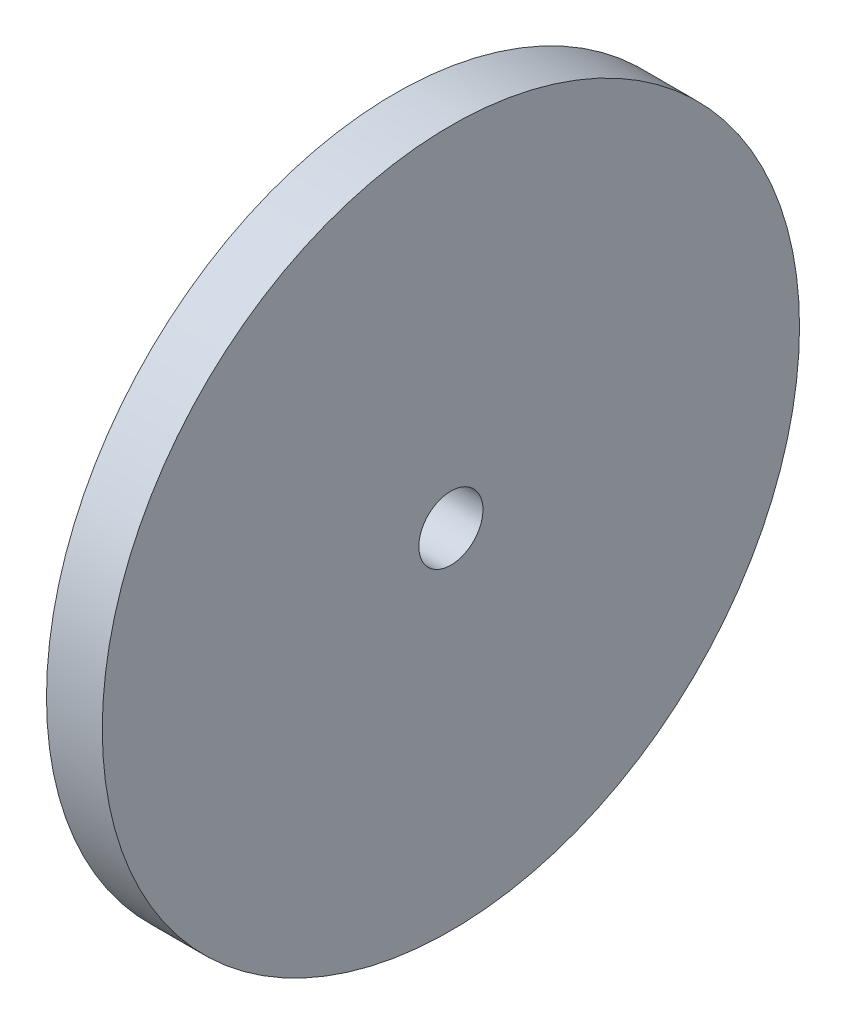
ISO-10303-21;
HEADER;
FILE_DESCRIPTION(('STEP AP214'),'2;1');
FILE_NAME('part.step','',(''),(''),'','','');
FILE_SCHEMA(('AUTOMOTIVE_DESIGN { 1 0 10303 214 1 1 1 1 }'));
ENDSEC;
DATA;
#1=APPLICATION_CONTEXT('core data for automotive mechanical design processes');
#2=APPLICATION_PROTOCOL_DEFINITION('international standard','automotive_design',2000,#1);
#3=PRODUCT_CONTEXT('',#1,'mechanical');
#4=PRODUCT('Part','Part','',(#3));
#5=PRODUCT_RELATED_PRODUCT_CATEGORY('part','',(#4));
#6=PRODUCT_DEFINITION_FORMATION('','',#4);
#7=PRODUCT_DEFINITION_CONTEXT('part definition',#1,'design');
#8=PRODUCT_DEFINITION('design','',#6,#7);
#9=PRODUCT_DEFINITION_SHAPE('','',#8);
#10=(LENGTH_UNIT() NAMED_UNIT(*) SI_UNIT(.MILLI.,.METRE.));
#11=(NAMED_UNIT(*) PLANE_ANGLE_UNIT() SI_UNIT($,.RADIAN.));
#12=(NAMED_UNIT(*) SI_UNIT($,.STERADIAN.) SOLID_ANGLE_UNIT());
#13=UNCERTAINTY_MEASURE_WITH_UNIT(LENGTH_MEASURE(1.E-05),#10,'distance_accuracy_value','');
#14=(GEOMETRIC_REPRESENTATION_CONTEXT(3) GLOBAL_UNCERTAINTY_ASSIGNED_CONTEXT((#13)) GLOBAL_UNIT_ASSIGNED_CONTEXT((#10,
#11,#12)) REPRESENTATION_CONTEXT('',''));
#15=CARTESIAN_POINT('',(0.,0.,0.));
#16=DIRECTION('',(0.,0.,1.));
#17=DIRECTION('',(1.,0.,0.));
#18=AXIS2_PLACEMENT_3D('',#15,#16,#17);
#19=CARTESIAN_POINT('',(2.54,0.,0.));
#20=DIRECTION('',(1.,0.,0.));
#21=DIRECTION('',(0.,0.,-1.));
#22=AXIS2_PLACEMENT_3D('',#19,#20,#21);
#23=PLANE('',#22);
#24=CARTESIAN_POINT('',(2.54,0.,0.));
#25=DIRECTION('',(1.,0.,0.));
#26=DIRECTION('',(0.,0.,-1.));
#27=AXIS2_PLACEMENT_3D('',#24,#25,#26);
#28=CIRCLE('',#27,15.875);
#29=CARTESIAN_POINT('',(2.54,0.,-15.875));
#30=VERTEX_POINT('',#29);
#31=EDGE_CURVE('E10',#30,#30,#28,.T.);
#32=ORIENTED_EDGE('',*,*,#31,.T.);
#33=EDGE_LOOP('',(#32));
#34=FACE_BOUND('',#33,.T.);
#35=CARTESIAN_POINT('',(2.54,0.,0.));
#36=DIRECTION('',(1.,0.,0.));
#37=DIRECTION('',(0.,0.,-1.));
#38=AXIS2_PLACEMENT_3D('',#35,#36,#37);
#39=CIRCLE('',#38,1.4605);
#40=CARTESIAN_POINT('',(2.54,0.,-1.4605));
#41=VERTEX_POINT('',#40);
#42=EDGE_CURVE('E48',#41,#41,#39,.T.);
#43=ORIENTED_EDGE('',*,*,#42,.F.);
#44=EDGE_LOOP('',(#43));
#45=FACE_BOUND('',#44,.T.);
#46=ADVANCED_FACE('F37',(#34,#45),#23,.T.);
#47=CARTESIAN_POINT('',(0.,0.,0.));
#48=DIRECTION('',(1.,0.,0.));
#49=DIRECTION('',(0.,0.,-1.));
#50=AXIS2_PLACEMENT_3D('',#47,#48,#49);
#51=PLANE('',#50);
#52=CARTESIAN_POINT('',(0.,0.,0.));
#53=DIRECTION('',(1.,0.,0.));
#54=DIRECTION('',(0.,0.,-1.));
#55=AXIS2_PLACEMENT_3D('',#52,#53,#54);
#56=CIRCLE('',#55,15.875);
#57=CARTESIAN_POINT('',(0.,0.,-15.875));
#58=VERTEX_POINT('',#57);
#59=EDGE_CURVE('E41',#58,#58,#56,.T.);
#60=ORIENTED_EDGE('',*,*,#59,.F.);
#61=EDGE_LOOP('',(#60));
#62=FACE_BOUND('',#61,.T.);
#63=CARTESIAN_POINT('',(0.,0.,0.));
#64=DIRECTION('',(1.,0.,0.));
#65=DIRECTION('',(0.,0.,-1.));
#66=AXIS2_PLACEMENT_3D('',#63,#64,#65);
#67=CIRCLE('',#66,1.4605);
#68=CARTESIAN_POINT('',(0.,0.,-1.4605));
#69=VERTEX_POINT('',#68);
#70=EDGE_CURVE('E50',#69,#69,#67,.T.);
#71=ORIENTED_EDGE('',*,*,#70,.T.);
#72=EDGE_LOOP('',(#71));
#73=FACE_BOUND('',#72,.T.);
#74=ADVANCED_FACE('F60',(#62,#73),#51,.F.);
#75=CARTESIAN_POINT('',(2.54,0.,0.));
#76=DIRECTION('',(-1.,0.,0.));
#77=DIRECTION('',(0.,0.,1.));
#78=AXIS2_PLACEMENT_3D('',#75,#76,#77);
#79=CYLINDRICAL_SURFACE('',#78,15.875);
#80=ORIENTED_EDGE('',*,*,#31,.F.);
#81=EDGE_LOOP('',(#80));
#82=FACE_BOUND('',#81,.T.);
#83=ORIENTED_EDGE('',*,*,#59,.T.);
#84=EDGE_LOOP('',(#83));
#85=FACE_BOUND('',#84,.T.);
#86=ADVANCED_FACE('F39',(#82,#85),#79,.T.);
#87=CARTESIAN_POINT('',(2.54,0.,0.));
#88=DIRECTION('',(-1.,0.,0.));
#89=DIRECTION('',(0.,0.,1.));
#90=AXIS2_PLACEMENT_3D('',#87,#88,#89);
#91=CYLINDRICAL_SURFACE('',#90,1.4605);
#92=ORIENTED_EDGE('',*,*,#42,.T.);
#93=EDGE_LOOP('',(#92));
#94=FACE_BOUND('',#93,.T.);
#95=ORIENTED_EDGE('',*,*,#70,.F.);
#96=EDGE_LOOP('',(#95));
#97=FACE_BOUND('',#96,.T.);
#98=ADVANCED_FACE('F56',(#94,#97),#91,.F.);
#99=CLOSED_SHELL('',(#46,#74,#86,#98));
#100=MANIFOLD_SOLID_BREP('B2',#99);
#101=ADVANCED_BREP_SHAPE_REPRESENTATION('',(#18,#100),#14);
#102=SHAPE_DEFINITION_REPRESENTATION(#9,#101);
ENDSEC;
END-ISO-10303-21;
